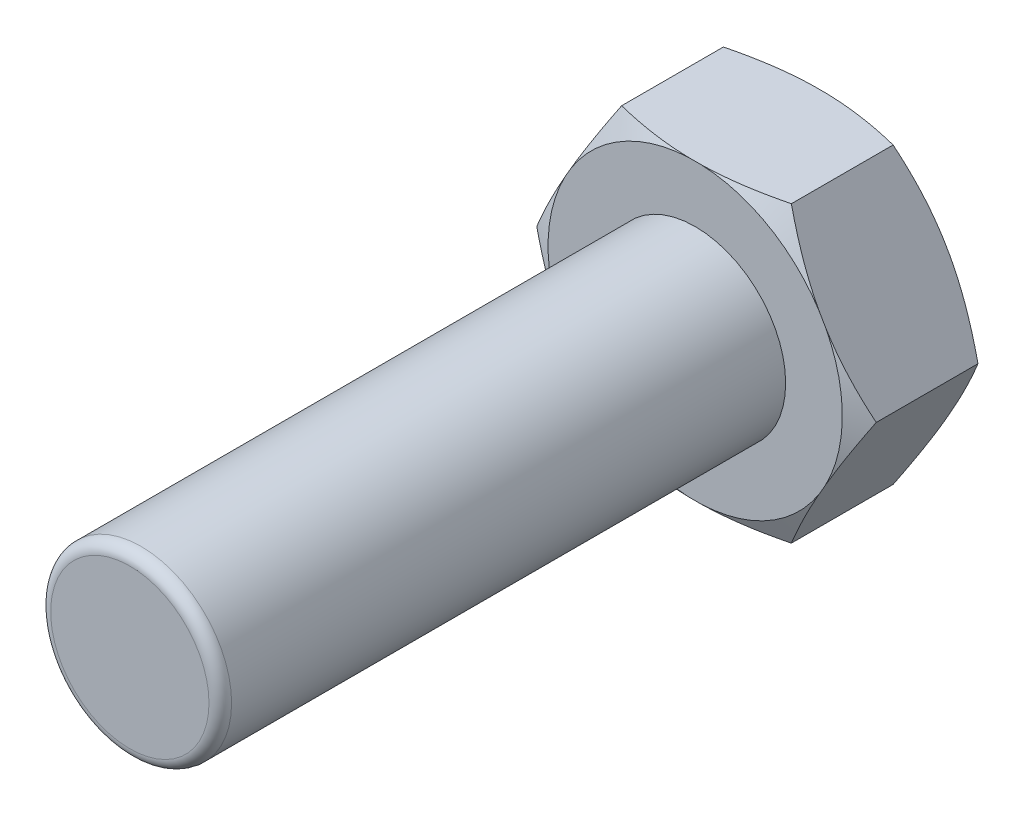
ISO-10303-21;
HEADER;
FILE_DESCRIPTION(('STEP AP214'),'2;1');
FILE_NAME('part.step','',(''),(''),'','','');
FILE_SCHEMA(('AUTOMOTIVE_DESIGN { 1 0 10303 214 1 1 1 1 }'));
ENDSEC;
DATA;
#1=APPLICATION_CONTEXT('core data for automotive mechanical design processes');
#2=APPLICATION_PROTOCOL_DEFINITION('international standard','automotive_design',2000,#1);
#3=PRODUCT_CONTEXT('',#1,'mechanical');
#4=PRODUCT('Part','Part','',(#3));
#5=PRODUCT_RELATED_PRODUCT_CATEGORY('part','',(#4));
#6=PRODUCT_DEFINITION_FORMATION('','',#4);
#7=PRODUCT_DEFINITION_CONTEXT('part definition',#1,'design');
#8=PRODUCT_DEFINITION('design','',#6,#7);
#9=PRODUCT_DEFINITION_SHAPE('','',#8);
#10=(LENGTH_UNIT() NAMED_UNIT(*) SI_UNIT(.MILLI.,.METRE.));
#11=(NAMED_UNIT(*) PLANE_ANGLE_UNIT() SI_UNIT($,.RADIAN.));
#12=(NAMED_UNIT(*) SI_UNIT($,.STERADIAN.) SOLID_ANGLE_UNIT());
#13=UNCERTAINTY_MEASURE_WITH_UNIT(LENGTH_MEASURE(1.E-05),#10,'distance_accuracy_value','');
#14=(GEOMETRIC_REPRESENTATION_CONTEXT(3) GLOBAL_UNCERTAINTY_ASSIGNED_CONTEXT((#13)) GLOBAL_UNIT_ASSIGNED_CONTEXT((#10,
#11,#12)) REPRESENTATION_CONTEXT('',''));
#15=CARTESIAN_POINT('',(0.,0.,0.));
#16=DIRECTION('',(0.,0.,1.));
#17=DIRECTION('',(1.,0.,0.));
#18=AXIS2_PLACEMENT_3D('',#15,#16,#17);
#19=CARTESIAN_POINT('',(0.,0.,5.5));
#20=DIRECTION('',(0.,0.,1.));
#21=DIRECTION('',(1.,0.,0.));
#22=AXIS2_PLACEMENT_3D('',#19,#20,#21);
#23=PLANE('',#22);
#24=CARTESIAN_POINT('',(0.,0.,5.5));
#25=DIRECTION('',(0.,0.,1.));
#26=DIRECTION('',(1.,0.,0.));
#27=AXIS2_PLACEMENT_3D('',#24,#25,#26);
#28=CIRCLE('',#27,4.);
#29=CARTESIAN_POINT('',(4.,0.,5.5));
#30=VERTEX_POINT('',#29);
#31=EDGE_CURVE('E220',#30,#30,#28,.T.);
#32=ORIENTED_EDGE('',*,*,#31,.F.);
#33=EDGE_LOOP('',(#32));
#34=FACE_BOUND('',#33,.T.);
#35=CARTESIAN_POINT('',(0.,0.,5.5));
#36=DIRECTION('',(0.,0.,1.));
#37=DIRECTION('',(1.,0.,0.));
#38=AXIS2_PLACEMENT_3D('',#35,#36,#37);
#39=CIRCLE('',#38,6.50555349946514);
#40=CARTESIAN_POINT('',(5.49479033678218,-3.48274395975477,5.5));
#41=VERTEX_POINT('',#40);
#42=CARTESIAN_POINT('',(0.268749575633286,-6.5,5.5));
#43=VERTEX_POINT('',#42);
#44=EDGE_CURVE('E227',#41,#43,#39,.F.);
#45=ORIENTED_EDGE('',*,*,#44,.F.);
#46=DIRECTION('',(0.5,0.866025403784439,0.));
#47=VECTOR('',#46,1.);
#48=CARTESIAN_POINT('',(3.75277674973257,-6.5,5.5));
#49=LINE('',#48,#47);
#50=CARTESIAN_POINT('',(5.76353991241553,-3.01725604024523,5.5));
#51=VERTEX_POINT('',#50);
#52=EDGE_CURVE('E203',#41,#51,#49,.T.);
#53=ORIENTED_EDGE('',*,*,#52,.T.);
#54=CARTESIAN_POINT('',(5.76353991241553,3.01725604024522,5.5));
#55=VERTEX_POINT('',#54);
#56=EDGE_CURVE('E225',#55,#51,#39,.F.);
#57=ORIENTED_EDGE('',*,*,#56,.F.);
#58=DIRECTION('',(-0.5,0.866025403784439,0.));
#59=VECTOR('',#58,1.);
#60=CARTESIAN_POINT('',(7.50555349946513,0.,5.5));
#61=LINE('',#60,#59);
#62=CARTESIAN_POINT('',(5.49479033678217,3.48274395975478,5.5));
#63=VERTEX_POINT('',#62);
#64=EDGE_CURVE('E258',#55,#63,#61,.T.);
#65=ORIENTED_EDGE('',*,*,#64,.T.);
#66=CARTESIAN_POINT('',(0.268749575633261,6.5,5.5));
#67=VERTEX_POINT('',#66);
#68=EDGE_CURVE('E226',#67,#63,#39,.F.);
#69=ORIENTED_EDGE('',*,*,#68,.F.);
#70=DIRECTION('',(-1.,0.,0.));
#71=VECTOR('',#70,1.);
#72=CARTESIAN_POINT('',(3.75277674973256,6.5,5.5));
#73=LINE('',#72,#71);
#74=CARTESIAN_POINT('',(-0.268749575633261,6.5,5.5));
#75=VERTEX_POINT('',#74);
#76=EDGE_CURVE('E264',#67,#75,#73,.T.);
#77=ORIENTED_EDGE('',*,*,#76,.T.);
#78=CARTESIAN_POINT('',(-5.4947903367822,3.48274395975472,5.5));
#79=VERTEX_POINT('',#78);
#80=EDGE_CURVE('E237',#79,#75,#39,.F.);
#81=ORIENTED_EDGE('',*,*,#80,.F.);
#82=DIRECTION('',(-0.5,-0.866025403784439,0.));
#83=VECTOR('',#82,1.);
#84=CARTESIAN_POINT('',(-3.75277674973257,6.5,5.5));
#85=LINE('',#84,#83);
#86=CARTESIAN_POINT('',(-5.7635399124155,3.01725604024527,5.5));
#87=VERTEX_POINT('',#86);
#88=EDGE_CURVE('E266',#79,#87,#85,.T.);
#89=ORIENTED_EDGE('',*,*,#88,.T.);
#90=CARTESIAN_POINT('',(-5.76353991241548,-3.01725604024531,5.5));
#91=VERTEX_POINT('',#90);
#92=EDGE_CURVE('E235',#91,#87,#39,.F.);
#93=ORIENTED_EDGE('',*,*,#92,.F.);
#94=DIRECTION('',(0.5,-0.866025403784438,0.));
#95=VECTOR('',#94,1.);
#96=CARTESIAN_POINT('',(-7.50555349946514,0.,5.5));
#97=LINE('',#96,#95);
#98=CARTESIAN_POINT('',(-5.49479033678222,-3.48274395975469,5.5));
#99=VERTEX_POINT('',#98);
#100=EDGE_CURVE('E273',#91,#99,#97,.T.);
#101=ORIENTED_EDGE('',*,*,#100,.T.);
#102=CARTESIAN_POINT('',(-0.268749575633286,-6.5,5.5));
#103=VERTEX_POINT('',#102);
#104=EDGE_CURVE('E231',#103,#99,#39,.F.);
#105=ORIENTED_EDGE('',*,*,#104,.F.);
#106=DIRECTION('',(1.,0.,0.));
#107=VECTOR('',#106,1.);
#108=CARTESIAN_POINT('',(-3.75277674973257,-6.5,5.5));
#109=LINE('',#108,#107);
#110=EDGE_CURVE('E208',#103,#43,#109,.T.);
#111=ORIENTED_EDGE('',*,*,#110,.T.);
#112=EDGE_LOOP('',(#45,#53,#57,#65,#69,#77,#81,#89,#93,#101,#105,#111));
#113=FACE_BOUND('',#112,.T.);
#114=ADVANCED_FACE('F39',(#34,#113),#23,.T.);
#115=CARTESIAN_POINT('',(0.,0.,0.));
#116=DIRECTION('',(0.,0.,1.));
#117=DIRECTION('',(1.,0.,0.));
#118=AXIS2_PLACEMENT_3D('',#115,#116,#117);
#119=PLANE('',#118);
#120=DIRECTION('',(0.5,0.866025403784439,0.));
#121=VECTOR('',#120,1.);
#122=CARTESIAN_POINT('',(3.75277674973257,-6.5,0.));
#123=LINE('',#122,#121);
#124=CARTESIAN_POINT('',(5.49479033678218,-3.48274395975477,0.));
#125=VERTEX_POINT('',#124);
#126=CARTESIAN_POINT('',(5.76353991241553,-3.01725604024523,0.));
#127=VERTEX_POINT('',#126);
#128=EDGE_CURVE('E278',#125,#127,#123,.T.);
#129=ORIENTED_EDGE('',*,*,#128,.F.);
#130=CARTESIAN_POINT('',(0.,0.,0.));
#131=DIRECTION('',(0.,0.,1.));
#132=DIRECTION('',(1.,0.,0.));
#133=AXIS2_PLACEMENT_3D('',#130,#131,#132);
#134=CIRCLE('',#133,6.50555349946514);
#135=CARTESIAN_POINT('',(0.268749575633286,-6.5,0.));
#136=VERTEX_POINT('',#135);
#137=EDGE_CURVE('E224',#125,#136,#134,.F.);
#138=ORIENTED_EDGE('',*,*,#137,.T.);
#139=DIRECTION('',(1.,0.,0.));
#140=VECTOR('',#139,1.);
#141=CARTESIAN_POINT('',(-3.75277674973257,-6.5,0.));
#142=LINE('',#141,#140);
#143=CARTESIAN_POINT('',(-0.268749575633286,-6.5,0.));
#144=VERTEX_POINT('',#143);
#145=EDGE_CURVE('E195',#144,#136,#142,.T.);
#146=ORIENTED_EDGE('',*,*,#145,.F.);
#147=CARTESIAN_POINT('',(-5.49479033678222,-3.48274395975469,0.));
#148=VERTEX_POINT('',#147);
#149=EDGE_CURVE('E596',#144,#148,#134,.F.);
#150=ORIENTED_EDGE('',*,*,#149,.T.);
#151=DIRECTION('',(0.5,-0.866025403784438,0.));
#152=VECTOR('',#151,1.);
#153=CARTESIAN_POINT('',(-7.50555349946514,0.,0.));
#154=LINE('',#153,#152);
#155=CARTESIAN_POINT('',(-5.76353991241548,-3.01725604024531,0.));
#156=VERTEX_POINT('',#155);
#157=EDGE_CURVE('E191',#156,#148,#154,.T.);
#158=ORIENTED_EDGE('',*,*,#157,.F.);
#159=CARTESIAN_POINT('',(-5.7635399124155,3.01725604024527,0.));
#160=VERTEX_POINT('',#159);
#161=EDGE_CURVE('E173',#156,#160,#134,.F.);
#162=ORIENTED_EDGE('',*,*,#161,.T.);
#163=DIRECTION('',(-0.5,-0.866025403784439,0.));
#164=VECTOR('',#163,1.);
#165=CARTESIAN_POINT('',(-3.75277674973257,6.5,0.));
#166=LINE('',#165,#164);
#167=CARTESIAN_POINT('',(-5.4947903367822,3.48274395975472,0.));
#168=VERTEX_POINT('',#167);
#169=EDGE_CURVE('E181',#168,#160,#166,.T.);
#170=ORIENTED_EDGE('',*,*,#169,.F.);
#171=CARTESIAN_POINT('',(-0.268749575633261,6.5,0.));
#172=VERTEX_POINT('',#171);
#173=EDGE_CURVE('E163',#168,#172,#134,.F.);
#174=ORIENTED_EDGE('',*,*,#173,.T.);
#175=DIRECTION('',(-1.,0.,0.));
#176=VECTOR('',#175,1.);
#177=CARTESIAN_POINT('',(3.75277674973256,6.5,0.));
#178=LINE('',#177,#176);
#179=CARTESIAN_POINT('',(0.268749575633261,6.5,0.));
#180=VERTEX_POINT('',#179);
#181=EDGE_CURVE('E192',#180,#172,#178,.T.);
#182=ORIENTED_EDGE('',*,*,#181,.F.);
#183=CARTESIAN_POINT('',(5.49479033678217,3.48274395975478,0.));
#184=VERTEX_POINT('',#183);
#185=EDGE_CURVE('E174',#180,#184,#134,.F.);
#186=ORIENTED_EDGE('',*,*,#185,.T.);
#187=DIRECTION('',(-0.5,0.866025403784439,0.));
#188=VECTOR('',#187,1.);
#189=CARTESIAN_POINT('',(7.50555349946513,0.,0.));
#190=LINE('',#189,#188);
#191=CARTESIAN_POINT('',(5.76353991241553,3.01725604024522,0.));
#192=VERTEX_POINT('',#191);
#193=EDGE_CURVE('E197',#192,#184,#190,.T.);
#194=ORIENTED_EDGE('',*,*,#193,.F.);
#195=EDGE_CURVE('E221',#192,#127,#134,.F.);
#196=ORIENTED_EDGE('',*,*,#195,.T.);
#197=EDGE_LOOP('',(#129,#138,#146,#150,#158,#162,#170,#174,#182,#186,#194,#196));
#198=FACE_BOUND('',#197,.T.);
#199=ADVANCED_FACE('F189',(#198),#119,.F.);
#200=CARTESIAN_POINT('',(3.75277674973257,-6.5,5.5));
#201=DIRECTION('',(-0.866025403784439,0.5,0.));
#202=DIRECTION('',(-0.5,-0.866025403784439,0.));
#203=AXIS2_PLACEMENT_3D('',#200,#201,#202);
#204=PLANE('',#203);
#205=DIRECTION('',(0.,0.,-1.));
#206=VECTOR('',#205,1.);
#207=CARTESIAN_POINT('',(3.75277674973257,-6.5,5.5));
#208=LINE('',#207,#206);
#209=CARTESIAN_POINT('',(3.75277674973257,-6.5,5.));
#210=VERTEX_POINT('',#209);
#211=CARTESIAN_POINT('',(3.75277674973257,-6.5,0.5));
#212=VERTEX_POINT('',#211);
#213=EDGE_CURVE('E204',#210,#212,#208,.T.);
#214=ORIENTED_EDGE('',*,*,#213,.T.);
#215=CARTESIAN_POINT('',(3.75237260454413,-6.5007,0.500202088914585));
#216=CARTESIAN_POINT('',(3.8581513468533,-6.3174858439598,0.447308100414797));
#217=CARTESIAN_POINT('',(3.96434221026252,-6.13355787323541,0.397552458642436));
#218=CARTESIAN_POINT('',(4.17756983432187,-5.76423679478743,0.305365614830753));
#219=CARTESIAN_POINT('',(4.28460700117574,-5.57884298349829,0.262938185371068));
#220=CARTESIAN_POINT('',(4.49959934134498,-5.20646532708704,0.186455410870334));
#221=CARTESIAN_POINT('',(4.60755563959989,-5.01947953351247,0.152412559968943));
#222=CARTESIAN_POINT('',(4.82409838792355,-4.6444164914053,0.0938297029314832));
#223=CARTESIAN_POINT('',(4.93268472608622,-4.4563394366997,0.0692880586741505));
#224=CARTESIAN_POINT('',(5.1478553862202,-4.0836529210495,0.031003092263815));
#225=CARTESIAN_POINT('',(5.25442927124948,-3.89906153741879,0.0170275284853245));
#226=CARTESIAN_POINT('',(5.4677990566594,-3.52949422828874,-0.000510400439065489));
#227=CARTESIAN_POINT('',(5.57459496772756,-3.34451828427808,-0.00407225212184421));
#228=CARTESIAN_POINT('',(5.78802860217816,-2.97484038536555,-0.000644602363145451));
#229=CARTESIAN_POINT('',(5.8946663719813,-2.79013835006069,0.00633352888495326));
#230=CARTESIAN_POINT('',(6.10763808623,-2.42126052040688,0.0305511734218139));
#231=CARTESIAN_POINT('',(6.21397205579703,-2.23708468254632,0.0477898120447853));
#232=CARTESIAN_POINT('',(6.41948815126255,-1.88112036342686,0.0905216057624534));
#233=CARTESIAN_POINT('',(6.5187011062663,-1.70927848459131,0.11543017165032));
#234=CARTESIAN_POINT('',(6.71656951926134,-1.36656034007088,0.173005823171236));
#235=CARTESIAN_POINT('',(6.81522491642766,-1.19568417973793,0.205673739175031));
#236=CARTESIAN_POINT('',(7.01298812041286,-0.853148262567952,0.278357612028755));
#237=CARTESIAN_POINT('',(7.11208869539026,-0.681501031647809,0.318451480294036));
#238=CARTESIAN_POINT('',(7.30956235262323,-0.339466624163873,0.404867578606761));
#239=CARTESIAN_POINT('',(7.40793575289547,-0.169078896779033,0.451186892347521));
#240=CARTESIAN_POINT('',(7.50595764465357,0.000700000000001562,0.500202088914583));
#241=B_SPLINE_CURVE_WITH_KNOTS('',3,(#215,#216,#217,#218,#219,#220,#221,#222,#223,#224,#225,
#226,#227,#228,#229,#230,#231,#232,#233,#234,#235,#236,#237,#238,#239,#240),.UNSPECIFIED.,.F.,
.F.,(4,2,2,2,2,2,2,2,2,2,2,2,4),(0.,0.654242187553569,1.30882018300877,1.96436776438002,
2.61980227114733,3.26037426611438,3.90097784487654,4.54089085456767,5.18074932213415,
5.78053406899308,6.38038303105972,6.98692412571604,7.59318207044967),.UNSPECIFIED.);
#242=EDGE_CURVE('E336',#212,#125,#241,.T.);
#243=ORIENTED_EDGE('',*,*,#242,.T.);
#244=ORIENTED_EDGE('',*,*,#128,.T.);
#245=CARTESIAN_POINT('',(7.50555349946514,0.,0.5));
#246=VERTEX_POINT('',#245);
#247=EDGE_CURVE('E603',#127,#246,#241,.T.);
#248=ORIENTED_EDGE('',*,*,#247,.T.);
#249=DIRECTION('',(0.,0.,-1.));
#250=VECTOR('',#249,1.);
#251=CARTESIAN_POINT('',(7.50555349946513,0.,5.5));
#252=LINE('',#251,#250);
#253=CARTESIAN_POINT('',(7.50555349946514,0.,5.));
#254=VERTEX_POINT('',#253);
#255=EDGE_CURVE('E218',#254,#246,#252,.T.);
#256=ORIENTED_EDGE('',*,*,#255,.F.);
#257=CARTESIAN_POINT('',(7.50595764465357,0.000700000000001858,4.99979791108542));
#258=CARTESIAN_POINT('',(7.4001789023444,-0.182514156040201,5.0526918995852));
#259=CARTESIAN_POINT('',(7.29398803893518,-0.366442126764588,5.10244754135756));
#260=CARTESIAN_POINT('',(7.08076041487583,-0.735763205212568,5.19463438516925));
#261=CARTESIAN_POINT('',(6.97372324802196,-0.921157016501705,5.23706181462893));
#262=CARTESIAN_POINT('',(6.75873090785272,-1.29353467291295,5.31354458912967));
#263=CARTESIAN_POINT('',(6.65077460959781,-1.48052046648752,5.34758744003106));
#264=CARTESIAN_POINT('',(6.43423186127415,-1.8555835085947,5.40617029706852));
#265=CARTESIAN_POINT('',(6.32564552311148,-2.0436605633003,5.43071194132585));
#266=CARTESIAN_POINT('',(6.1104748629775,-2.41634707895049,5.46899690773619));
#267=CARTESIAN_POINT('',(6.00390097794822,-2.6009384625812,5.48297247151467));
#268=CARTESIAN_POINT('',(5.7905311925383,-2.97050577171125,5.50051040043907));
#269=CARTESIAN_POINT('',(5.68373528147015,-3.15548171572191,5.50407225212184));
#270=CARTESIAN_POINT('',(5.47030164701954,-3.52515961463445,5.50064460236315));
#271=CARTESIAN_POINT('',(5.36366387721641,-3.70986164993931,5.49366647111505));
#272=CARTESIAN_POINT('',(5.1506921629677,-4.07873947959311,5.46944882657819));
#273=CARTESIAN_POINT('',(5.04435819340067,-4.26291531745367,5.45221018795521));
#274=CARTESIAN_POINT('',(4.83884209793515,-4.61887963657314,5.40947839423755));
#275=CARTESIAN_POINT('',(4.7396291429314,-4.79072151540868,5.38456982834968));
#276=CARTESIAN_POINT('',(4.54176072993636,-5.13343965992911,5.32699417682876));
#277=CARTESIAN_POINT('',(4.44310533277004,-5.30431582026207,5.29432626082497));
#278=CARTESIAN_POINT('',(4.24534212878484,-5.64685173743205,5.22164238797124));
#279=CARTESIAN_POINT('',(4.14624155380744,-5.81849896835219,5.18154851970596));
#280=CARTESIAN_POINT('',(3.94876789657447,-6.16053337583612,5.09513242139324));
#281=CARTESIAN_POINT('',(3.85039449630223,-6.33092110322097,5.04881310765248));
#282=CARTESIAN_POINT('',(3.75237260454413,-6.5007,4.99979791108542));
#283=B_SPLINE_CURVE_WITH_KNOTS('',3,(#257,#258,#259,#260,#261,#262,#263,#264,#265,#266,#267,
#268,#269,#270,#271,#272,#273,#274,#275,#276,#277,#278,#279,#280,#281,#282),.UNSPECIFIED.,.F.,
.F.,(4,2,2,2,2,2,2,2,2,2,2,2,4),(0.,0.654242187553568,1.30882018300877,1.96436776438002,
2.61980227114733,3.26037426611438,3.90097784487653,4.54089085456766,5.18074932213414,
5.78053406899307,6.38038303105972,6.98692412571604,7.59318207044967),.UNSPECIFIED.);
#284=EDGE_CURVE('E280',#254,#51,#283,.T.);
#285=ORIENTED_EDGE('',*,*,#284,.T.);
#286=ORIENTED_EDGE('',*,*,#52,.F.);
#287=EDGE_CURVE('E372',#41,#210,#283,.T.);
#288=ORIENTED_EDGE('',*,*,#287,.T.);
#289=EDGE_LOOP('',(#214,#243,#244,#248,#256,#285,#286,#288));
#290=FACE_BOUND('',#289,.T.);
#291=ADVANCED_FACE('F385',(#290),#204,.F.);
#292=CARTESIAN_POINT('',(7.50555349946513,0.,5.5));
#293=DIRECTION('',(-0.866025403784439,-0.5,0.));
#294=DIRECTION('',(0.5,-0.866025403784439,0.));
#295=AXIS2_PLACEMENT_3D('',#292,#293,#294);
#296=PLANE('',#295);
#297=ORIENTED_EDGE('',*,*,#255,.T.);
#298=CARTESIAN_POINT('',(7.50595764465356,-0.00069999999999797,0.500202088914583));
#299=CARTESIAN_POINT('',(7.4001789023444,0.182514156040205,0.447308100414796));
#300=CARTESIAN_POINT('',(7.29398803893518,0.366442126764592,0.397552458642435));
#301=CARTESIAN_POINT('',(7.08076041487583,0.735763205212573,0.305365614830752));
#302=CARTESIAN_POINT('',(6.97372324802196,0.921157016501709,0.262938185371066));
#303=CARTESIAN_POINT('',(6.75873090785272,1.29353467291296,0.186455410870333));
#304=CARTESIAN_POINT('',(6.65077460959781,1.48052046648753,0.152412559968942));
#305=CARTESIAN_POINT('',(6.43423186127415,1.85558350859471,0.0938297029314831));
#306=CARTESIAN_POINT('',(6.32564552311148,2.0436605633003,0.0692880586741502));
#307=CARTESIAN_POINT('',(6.1104748629775,2.4163470789505,0.0310030922638145));
#308=CARTESIAN_POINT('',(6.00390097794822,2.60093846258121,0.0170275284853243));
#309=CARTESIAN_POINT('',(5.7905311925383,2.97050577171126,-0.000510400439065394));
#310=CARTESIAN_POINT('',(5.68373528147014,3.15548171572192,-0.00407225212184394));
#311=CARTESIAN_POINT('',(5.47030164701954,3.52515961463445,-0.000644602363145258));
#312=CARTESIAN_POINT('',(5.3636638772164,3.70986164993931,0.00633352888495324));
#313=CARTESIAN_POINT('',(5.15069216296769,4.07873947959312,0.0305511734218142));
#314=CARTESIAN_POINT('',(5.04435819340067,4.26291531745368,0.0477898120447861));
#315=CARTESIAN_POINT('',(4.83884209793515,4.61887963657314,0.0905216057624544));
#316=CARTESIAN_POINT('',(4.7396291429314,4.79072151540869,0.115430171650321));
#317=CARTESIAN_POINT('',(4.54176072993636,5.13343965992912,0.173005823171237));
#318=CARTESIAN_POINT('',(4.44310533277004,5.30431582026207,0.205673739175032));
#319=CARTESIAN_POINT('',(4.24534212878483,5.64685173743205,0.278357612028756));
#320=CARTESIAN_POINT('',(4.14624155380744,5.81849896835219,0.318451480294037));
#321=CARTESIAN_POINT('',(3.94876789657447,6.16053337583613,0.404867578606762));
#322=CARTESIAN_POINT('',(3.85039449630223,6.33092110322097,0.451186892347522));
#323=CARTESIAN_POINT('',(3.75237260454413,6.5007,0.500202088914585));
#324=B_SPLINE_CURVE_WITH_KNOTS('',3,(#298,#299,#300,#301,#302,#303,#304,#305,#306,#307,#308,
#309,#310,#311,#312,#313,#314,#315,#316,#317,#318,#319,#320,#321,#322,#323),.UNSPECIFIED.,.F.,
.F.,(4,2,2,2,2,2,2,2,2,2,2,2,4),(0.,0.654242187553569,1.30882018300877,1.96436776438002,
2.61980227114733,3.26037426611438,3.90097784487654,4.54089085456767,5.18074932213415,
5.78053406899307,6.38038303105972,6.98692412571604,7.59318207044967),.UNSPECIFIED.);
#325=EDGE_CURVE('E285',#246,#192,#324,.T.);
#326=ORIENTED_EDGE('',*,*,#325,.T.);
#327=ORIENTED_EDGE('',*,*,#193,.T.);
#328=CARTESIAN_POINT('',(3.75277674973257,6.5,0.5));
#329=VERTEX_POINT('',#328);
#330=EDGE_CURVE('E284',#184,#329,#324,.T.);
#331=ORIENTED_EDGE('',*,*,#330,.T.);
#332=DIRECTION('',(0.,0.,-1.));
#333=VECTOR('',#332,1.);
#334=CARTESIAN_POINT('',(3.75277674973256,6.5,5.5));
#335=LINE('',#334,#333);
#336=CARTESIAN_POINT('',(3.75277674973257,6.5,5.));
#337=VERTEX_POINT('',#336);
#338=EDGE_CURVE('E215',#337,#329,#335,.T.);
#339=ORIENTED_EDGE('',*,*,#338,.F.);
#340=CARTESIAN_POINT('',(3.75237260454413,6.5007,4.99979791108542));
#341=CARTESIAN_POINT('',(3.85815134685329,6.3174858439598,5.0526918995852));
#342=CARTESIAN_POINT('',(3.96434221026252,6.13355787323541,5.10244754135756));
#343=CARTESIAN_POINT('',(4.17756983432187,5.76423679478743,5.19463438516925));
#344=CARTESIAN_POINT('',(4.28460700117574,5.57884298349829,5.23706181462893));
#345=CARTESIAN_POINT('',(4.49959934134498,5.20646532708704,5.31354458912967));
#346=CARTESIAN_POINT('',(4.60755563959989,5.01947953351247,5.34758744003106));
#347=CARTESIAN_POINT('',(4.82409838792355,4.6444164914053,5.40617029706852));
#348=CARTESIAN_POINT('',(4.93268472608622,4.4563394366997,5.43071194132585));
#349=CARTESIAN_POINT('',(5.1478553862202,4.08365292104951,5.46899690773619));
#350=CARTESIAN_POINT('',(5.25442927124948,3.89906153741879,5.48297247151467));
#351=CARTESIAN_POINT('',(5.4677990566594,3.52949422828874,5.50051040043907));
#352=CARTESIAN_POINT('',(5.57459496772755,3.34451828427809,5.50407225212184));
#353=CARTESIAN_POINT('',(5.78802860217816,2.97484038536555,5.50064460236315));
#354=CARTESIAN_POINT('',(5.8946663719813,2.79013835006069,5.49366647111505));
#355=CARTESIAN_POINT('',(6.10763808623,2.42126052040689,5.46944882657819));
#356=CARTESIAN_POINT('',(6.21397205579703,2.23708468254632,5.45221018795521));
#357=CARTESIAN_POINT('',(6.41948815126255,1.88112036342686,5.40947839423755));
#358=CARTESIAN_POINT('',(6.5187011062663,1.70927848459132,5.38456982834968));
#359=CARTESIAN_POINT('',(6.71656951926134,1.36656034007089,5.32699417682876));
#360=CARTESIAN_POINT('',(6.81522491642766,1.19568417973793,5.29432626082497));
#361=CARTESIAN_POINT('',(7.01298812041286,0.853148262567956,5.22164238797124));
#362=CARTESIAN_POINT('',(7.11208869539026,0.681501031647813,5.18154851970596));
#363=CARTESIAN_POINT('',(7.30956235262322,0.339466624163877,5.09513242139324));
#364=CARTESIAN_POINT('',(7.40793575289547,0.169078896779037,5.04881310765248));
#365=CARTESIAN_POINT('',(7.50595764465356,-0.000699999999997427,4.99979791108542));
#366=B_SPLINE_CURVE_WITH_KNOTS('',3,(#340,#341,#342,#343,#344,#345,#346,#347,#348,#349,#350,
#351,#352,#353,#354,#355,#356,#357,#358,#359,#360,#361,#362,#363,#364,#365),.UNSPECIFIED.,.F.,
.F.,(4,2,2,2,2,2,2,2,2,2,2,2,4),(0.,0.65424218755357,1.30882018300877,1.96436776438002,
2.61980227114733,3.26037426611438,3.90097784487654,4.54089085456767,5.18074932213415,
5.78053406899307,6.38038303105972,6.98692412571604,7.59318207044967),.UNSPECIFIED.);
#367=EDGE_CURVE('E246',#337,#63,#366,.T.);
#368=ORIENTED_EDGE('',*,*,#367,.T.);
#369=ORIENTED_EDGE('',*,*,#64,.F.);
#370=EDGE_CURVE('E260',#55,#254,#366,.T.);
#371=ORIENTED_EDGE('',*,*,#370,.T.);
#372=EDGE_LOOP('',(#297,#326,#327,#331,#339,#368,#369,#371));
#373=FACE_BOUND('',#372,.T.);
#374=ADVANCED_FACE('F256',(#373),#296,.F.);
#375=CARTESIAN_POINT('',(3.75277674973256,6.5,5.5));
#376=DIRECTION('',(0.,-1.,0.));
#377=DIRECTION('',(0.,0.,-1.));
#378=AXIS2_PLACEMENT_3D('',#375,#376,#377);
#379=PLANE('',#378);
#380=ORIENTED_EDGE('',*,*,#338,.T.);
#381=CARTESIAN_POINT('',(3.75347674973256,6.5,0.500175012240365));
#382=CARTESIAN_POINT('',(3.54192162519923,6.5,0.447282755969558));
#383=CARTESIAN_POINT('',(3.32954227379659,6.5,0.397528857024414));
#384=CARTESIAN_POINT('',(2.90309182650538,6.5,0.305345485202523));
#385=CARTESIAN_POINT('',(2.68901991825973,6.5,0.262919784770842));
#386=CARTESIAN_POINT('',(2.25904019363984,6.5,0.186440425956892));
#387=CARTESIAN_POINT('',(2.04313012776865,6.5,0.152399260005533));
#388=CARTESIAN_POINT('',(1.6100497632385,6.5,0.0938196616704836));
#389=CARTESIAN_POINT('',(1.39287968837432,6.5,0.0692795912208281));
#390=CARTESIAN_POINT('',(0.962543417507529,6.5,0.0309975490733606));
#391=CARTESIAN_POINT('',(0.749398092974236,6.5,0.0170233475587274));
#392=CARTESIAN_POINT('',(0.322663478736452,6.5,-0.000512066325803271));
#393=CARTESIAN_POINT('',(0.109074167659224,6.5,-0.00407276522012902));
#394=CARTESIAN_POINT('',(-0.31778804759895,6.5,-0.000643068305750199));
#395=CARTESIAN_POINT('',(-0.531061044668984,6.5,0.00633595837845697));
#396=CARTESIAN_POINT('',(-0.95699936095713,6.5,0.0305551115069941));
#397=CARTESIAN_POINT('',(-1.16966473042201,6.5,0.0477943632817789));
#398=CARTESIAN_POINT('',(-1.58068117508018,6.5,0.0905259486290271));
#399=CARTESIAN_POINT('',(-1.77909395716747,6.5,0.115433252203116));
#400=CARTESIAN_POINT('',(-2.17480466284762,6.5,0.173005342178703));
#401=CARTESIAN_POINT('',(-2.3721024648757,6.5,0.205670958367692));
#402=CARTESIAN_POINT('',(-2.76760272502698,6.5,0.278349291876491));
#403=CARTESIAN_POINT('',(-2.96579072274422,6.5,0.318439903827291));
#404=CARTESIAN_POINT('',(-3.360711947741,6.5,0.404848758409281));
#405=CARTESIAN_POINT('',(-3.5574458108006,6.5,0.451164085844501));
#406=CARTESIAN_POINT('',(-3.75347674973257,6.5,0.500175012240366));
#407=B_SPLINE_CURVE_WITH_KNOTS('',3,(#381,#382,#383,#384,#385,#386,#387,#388,#389,#390,#391,
#392,#393,#394,#395,#396,#397,#398,#399,#400,#401,#402,#403,#404,#405,#406),.UNSPECIFIED.,.F.,
.F.,(4,2,2,2,2,2,2,2,2,2,2,2,4),(0.,0.654234056420655,1.30880390529539,1.96434320152268,
2.61976942707328,3.26033383975563,3.9009298372606,4.54083532196571,5.18068626345358,
5.78043149769994,6.38024090638788,6.98674140943669,7.5929588559283),.UNSPECIFIED.);
#408=EDGE_CURVE('E290',#329,#180,#407,.T.);
#409=ORIENTED_EDGE('',*,*,#408,.T.);
#410=ORIENTED_EDGE('',*,*,#181,.T.);
#411=CARTESIAN_POINT('',(-3.75277674973257,6.5,0.5));
#412=VERTEX_POINT('',#411);
#413=EDGE_CURVE('E168',#172,#412,#407,.T.);
#414=ORIENTED_EDGE('',*,*,#413,.T.);
#415=DIRECTION('',(0.,0.,-1.));
#416=VECTOR('',#415,1.);
#417=CARTESIAN_POINT('',(-3.75277674973257,6.5,5.5));
#418=LINE('',#417,#416);
#419=CARTESIAN_POINT('',(-3.75277674973257,6.5,5.));
#420=VERTEX_POINT('',#419);
#421=EDGE_CURVE('E184',#420,#412,#418,.T.);
#422=ORIENTED_EDGE('',*,*,#421,.F.);
#423=CARTESIAN_POINT('',(-3.75347674973257,6.5,4.99982498775963));
#424=CARTESIAN_POINT('',(-3.54192162519923,6.5,5.05271724403044));
#425=CARTESIAN_POINT('',(-3.32954227379659,6.5,5.10247114297559));
#426=CARTESIAN_POINT('',(-2.90309182650538,6.5,5.19465451479748));
#427=CARTESIAN_POINT('',(-2.68901991825973,6.5,5.23708021522916));
#428=CARTESIAN_POINT('',(-2.25904019363984,6.5,5.31355957404311));
#429=CARTESIAN_POINT('',(-2.04313012776865,6.5,5.34760073999447));
#430=CARTESIAN_POINT('',(-1.61004976323851,6.5,5.40618033832952));
#431=CARTESIAN_POINT('',(-1.39287968837432,6.5,5.43072040877917));
#432=CARTESIAN_POINT('',(-0.962543417507533,6.5,5.46900245092664));
#433=CARTESIAN_POINT('',(-0.749398092974241,6.5,5.48297665244127));
#434=CARTESIAN_POINT('',(-0.322663478736457,6.5,5.5005120663258));
#435=CARTESIAN_POINT('',(-0.10907416765923,6.5,5.50407276522013));
#436=CARTESIAN_POINT('',(0.317788047598944,6.5,5.50064306830575));
#437=CARTESIAN_POINT('',(0.531061044668979,6.5,5.49366404162154));
#438=CARTESIAN_POINT('',(0.956999360957123,6.5,5.46944488849301));
#439=CARTESIAN_POINT('',(1.16966473042201,6.5,5.45220563671822));
#440=CARTESIAN_POINT('',(1.58068117508018,6.5,5.40947405137097));
#441=CARTESIAN_POINT('',(1.77909395716747,6.5,5.38456674779688));
#442=CARTESIAN_POINT('',(2.17480466284761,6.5,5.3269946578213));
#443=CARTESIAN_POINT('',(2.3721024648757,6.5,5.29432904163231));
#444=CARTESIAN_POINT('',(2.76760272502698,6.5,5.22165070812351));
#445=CARTESIAN_POINT('',(2.96579072274422,6.5,5.18156009617271));
#446=CARTESIAN_POINT('',(3.360711947741,6.5,5.09515124159072));
#447=CARTESIAN_POINT('',(3.55744581080059,6.5,5.0488359141555));
#448=CARTESIAN_POINT('',(3.75347674973256,6.5,4.99982498775963));
#449=B_SPLINE_CURVE_WITH_KNOTS('',3,(#423,#424,#425,#426,#427,#428,#429,#430,#431,#432,#433,
#434,#435,#436,#437,#438,#439,#440,#441,#442,#443,#444,#445,#446,#447,#448),.UNSPECIFIED.,.F.,
.F.,(4,2,2,2,2,2,2,2,2,2,2,2,4),(0.,0.654234056420655,1.30880390529539,1.96434320152268,
2.61976942707328,3.26033383975563,3.9009298372606,4.54083532196571,5.18068626345358,
5.78043149769993,6.38024090638788,6.98674140943668,7.5929588559283),.UNSPECIFIED.);
#450=EDGE_CURVE('E397',#420,#75,#449,.T.);
#451=ORIENTED_EDGE('',*,*,#450,.T.);
#452=ORIENTED_EDGE('',*,*,#76,.F.);
#453=EDGE_CURVE('E248',#67,#337,#449,.T.);
#454=ORIENTED_EDGE('',*,*,#453,.T.);
#455=EDGE_LOOP('',(#380,#409,#410,#414,#422,#451,#452,#454));
#456=FACE_BOUND('',#455,.T.);
#457=ADVANCED_FACE('F292',(#456),#379,.F.);
#458=CARTESIAN_POINT('',(-3.75277674973257,6.5,5.5));
#459=DIRECTION('',(0.866025403784439,-0.5,0.));
#460=DIRECTION('',(0.5,0.866025403784439,0.));
#461=AXIS2_PLACEMENT_3D('',#458,#459,#460);
#462=PLANE('',#461);
#463=ORIENTED_EDGE('',*,*,#421,.T.);
#464=CARTESIAN_POINT('',(-3.75237260454414,6.5007,0.500202088914585));
#465=CARTESIAN_POINT('',(-3.8581513468533,6.3174858439598,0.447308100414798));
#466=CARTESIAN_POINT('',(-3.96434221026252,6.13355787323541,0.397552458642437));
#467=CARTESIAN_POINT('',(-4.17756983432187,5.76423679478743,0.305365614830754));
#468=CARTESIAN_POINT('',(-4.28460700117574,5.57884298349829,0.262938185371069));
#469=CARTESIAN_POINT('',(-4.49959934134498,5.20646532708704,0.186455410870335));
#470=CARTESIAN_POINT('',(-4.60755563959989,5.01947953351247,0.152412559968944));
#471=CARTESIAN_POINT('',(-4.82409838792355,4.6444164914053,0.0938297029314844));
#472=CARTESIAN_POINT('',(-4.93268472608622,4.4563394366997,0.069288058674152));
#473=CARTESIAN_POINT('',(-5.1478553862202,4.08365292104951,0.0310030922638162));
#474=CARTESIAN_POINT('',(-5.25442927124948,3.89906153741879,0.0170275284853252));
#475=CARTESIAN_POINT('',(-5.4677990566594,3.52949422828874,-0.000510400439064884));
#476=CARTESIAN_POINT('',(-5.57459496772756,3.34451828427809,-0.00407225212184326));
#477=CARTESIAN_POINT('',(-5.78802860217816,2.97484038536555,-0.000644602363144531));
#478=CARTESIAN_POINT('',(-5.8946663719813,2.79013835006069,0.00633352888495383));
#479=CARTESIAN_POINT('',(-6.10763808623001,2.42126052040689,0.0305511734218144));
#480=CARTESIAN_POINT('',(-6.21397205579703,2.23708468254632,0.0477898120447861));
#481=CARTESIAN_POINT('',(-6.41948815126255,1.88112036342686,0.0905216057624543));
#482=CARTESIAN_POINT('',(-6.5187011062663,1.70927848459132,0.115430171650321));
#483=CARTESIAN_POINT('',(-6.71656951926134,1.36656034007089,0.173005823171237));
#484=CARTESIAN_POINT('',(-6.81522491642766,1.19568417973793,0.205673739175032));
#485=CARTESIAN_POINT('',(-7.01298812041287,0.853148262567952,0.278357612028756));
#486=CARTESIAN_POINT('',(-7.11208869539026,0.681501031647809,0.318451480294037));
#487=CARTESIAN_POINT('',(-7.30956235262323,0.339466624163872,0.404867578606763));
#488=CARTESIAN_POINT('',(-7.40793575289548,0.169078896779031,0.451186892347523));
#489=CARTESIAN_POINT('',(-7.50595764465357,-0.000700000000003896,0.500202088914586));
#490=B_SPLINE_CURVE_WITH_KNOTS('',3,(#464,#465,#466,#467,#468,#469,#470,#471,#472,#473,#474,
#475,#476,#477,#478,#479,#480,#481,#482,#483,#484,#485,#486,#487,#488,#489),.UNSPECIFIED.,.F.,
.F.,(4,2,2,2,2,2,2,2,2,2,2,2,4),(0.,0.65424218755357,1.30882018300877,1.96436776438002,
2.61980227114733,3.26037426611438,3.90097784487654,4.54089085456767,5.18074932213415,
5.78053406899307,6.38038303105972,6.98692412571605,7.59318207044967),.UNSPECIFIED.);
#491=EDGE_CURVE('E166',#412,#168,#490,.T.);
#492=ORIENTED_EDGE('',*,*,#491,.T.);
#493=ORIENTED_EDGE('',*,*,#169,.T.);
#494=CARTESIAN_POINT('',(-7.50555349946514,0.,0.5));
#495=VERTEX_POINT('',#494);
#496=EDGE_CURVE('E185',#160,#495,#490,.T.);
#497=ORIENTED_EDGE('',*,*,#496,.T.);
#498=DIRECTION('',(0.,0.,-1.));
#499=VECTOR('',#498,1.);
#500=CARTESIAN_POINT('',(-7.50555349946514,0.,5.5));
#501=LINE('',#500,#499);
#502=CARTESIAN_POINT('',(-7.50555349946514,0.,5.));
#503=VERTEX_POINT('',#502);
#504=EDGE_CURVE('E211',#503,#495,#501,.T.);
#505=ORIENTED_EDGE('',*,*,#504,.F.);
#506=CARTESIAN_POINT('',(-7.50595764465357,-0.000700000000003274,4.99979791108541));
#507=CARTESIAN_POINT('',(-7.40017890234441,0.1825141560402,5.0526918995852));
#508=CARTESIAN_POINT('',(-7.29398803893518,0.366442126764587,5.10244754135756));
#509=CARTESIAN_POINT('',(-7.08076041487584,0.735763205212567,5.19463438516925));
#510=CARTESIAN_POINT('',(-6.97372324802196,0.921157016501703,5.23706181462893));
#511=CARTESIAN_POINT('',(-6.75873090785273,1.29353467291295,5.31354458912967));
#512=CARTESIAN_POINT('',(-6.65077460959781,1.48052046648752,5.34758744003106));
#513=CARTESIAN_POINT('',(-6.43423186127416,1.8555835085947,5.40617029706852));
#514=CARTESIAN_POINT('',(-6.32564552311149,2.0436605633003,5.43071194132585));
#515=CARTESIAN_POINT('',(-6.1104748629775,2.41634707895049,5.46899690773618));
#516=CARTESIAN_POINT('',(-6.00390097794823,2.6009384625812,5.48297247151467));
#517=CARTESIAN_POINT('',(-5.79053119253831,2.97050577171125,5.50051040043906));
#518=CARTESIAN_POINT('',(-5.68373528147015,3.15548171572191,5.50407225212184));
#519=CARTESIAN_POINT('',(-5.47030164701954,3.52515961463445,5.50064460236314));
#520=CARTESIAN_POINT('',(-5.36366387721641,3.70986164993931,5.49366647111504));
#521=CARTESIAN_POINT('',(-5.1506921629677,4.07873947959311,5.46944882657819));
#522=CARTESIAN_POINT('',(-5.04435819340068,4.26291531745367,5.45221018795521));
#523=CARTESIAN_POINT('',(-4.83884209793515,4.61887963657314,5.40947839423755));
#524=CARTESIAN_POINT('',(-4.7396291429314,4.79072151540868,5.38456982834968));
#525=CARTESIAN_POINT('',(-4.54176072993636,5.13343965992911,5.32699417682876));
#526=CARTESIAN_POINT('',(-4.44310533277004,5.30431582026207,5.29432626082497));
#527=CARTESIAN_POINT('',(-4.24534212878484,5.64685173743205,5.22164238797124));
#528=CARTESIAN_POINT('',(-4.14624155380744,5.81849896835219,5.18154851970596));
#529=CARTESIAN_POINT('',(-3.94876789657447,6.16053337583613,5.09513242139324));
#530=CARTESIAN_POINT('',(-3.85039449630223,6.33092110322097,5.04881310765248));
#531=CARTESIAN_POINT('',(-3.75237260454414,6.5007,4.99979791108541));
#532=B_SPLINE_CURVE_WITH_KNOTS('',3,(#506,#507,#508,#509,#510,#511,#512,#513,#514,#515,#516,
#517,#518,#519,#520,#521,#522,#523,#524,#525,#526,#527,#528,#529,#530,#531),.UNSPECIFIED.,.F.,
.F.,(4,2,2,2,2,2,2,2,2,2,2,2,4),(0.,0.654242187553569,1.30882018300877,1.96436776438002,
2.61980227114733,3.26037426611438,3.90097784487654,4.54089085456767,5.18074932213415,
5.78053406899307,6.38038303105972,6.98692412571605,7.59318207044967),.UNSPECIFIED.);
#533=EDGE_CURVE('E379',#503,#87,#532,.T.);
#534=ORIENTED_EDGE('',*,*,#533,.T.);
#535=ORIENTED_EDGE('',*,*,#88,.F.);
#536=EDGE_CURVE('E608',#79,#420,#532,.T.);
#537=ORIENTED_EDGE('',*,*,#536,.T.);
#538=EDGE_LOOP('',(#463,#492,#493,#497,#505,#534,#535,#537));
#539=FACE_BOUND('',#538,.T.);
#540=ADVANCED_FACE('F179',(#539),#462,.F.);
#541=CARTESIAN_POINT('',(-7.50555349946514,0.,5.5));
#542=DIRECTION('',(0.866025403784439,0.5,0.));
#543=DIRECTION('',(-0.5,0.866025403784439,0.));
#544=AXIS2_PLACEMENT_3D('',#541,#542,#543);
#545=PLANE('',#544);
#546=ORIENTED_EDGE('',*,*,#504,.T.);
#547=CARTESIAN_POINT('',(-7.50595764465357,0.000699999999996554,0.500202088914586));
#548=CARTESIAN_POINT('',(-7.40017890234441,-0.182514156040207,0.447308100414798));
#549=CARTESIAN_POINT('',(-7.29398803893518,-0.366442126764594,0.397552458642437));
#550=CARTESIAN_POINT('',(-7.08076041487584,-0.735763205212574,0.305365614830754));
#551=CARTESIAN_POINT('',(-6.97372324802196,-0.921157016501711,0.262938185371069));
#552=CARTESIAN_POINT('',(-6.75873090785273,-1.29353467291296,0.186455410870335));
#553=CARTESIAN_POINT('',(-6.65077460959781,-1.48052046648753,0.152412559968944));
#554=CARTESIAN_POINT('',(-6.43423186127415,-1.85558350859471,0.093829702931485));
#555=CARTESIAN_POINT('',(-6.32564552311149,-2.0436605633003,0.0692880586741526));
#556=CARTESIAN_POINT('',(-6.1104748629775,-2.4163470789505,0.0310030922638168));
#557=CARTESIAN_POINT('',(-6.00390097794822,-2.60093846258121,0.0170275284853259));
#558=CARTESIAN_POINT('',(-5.7905311925383,-2.97050577171126,-0.000510400439063934));
#559=CARTESIAN_POINT('',(-5.68373528147015,-3.15548171572192,-0.00407225212184203));
#560=CARTESIAN_POINT('',(-5.47030164701954,-3.52515961463445,-0.000644602363143189));
#561=CARTESIAN_POINT('',(-5.36366387721641,-3.70986164993931,0.006333528884955));
#562=CARTESIAN_POINT('',(-5.1506921629677,-4.07873947959312,0.0305511734218156));
#563=CARTESIAN_POINT('',(-5.04435819340068,-4.26291531745368,0.0477898120447875));
#564=CARTESIAN_POINT('',(-4.83884209793515,-4.61887963657314,0.0905216057624556));
#565=CARTESIAN_POINT('',(-4.7396291429314,-4.79072151540869,0.115430171650322));
#566=CARTESIAN_POINT('',(-4.54176072993636,-5.13343965992912,0.173005823171238));
#567=CARTESIAN_POINT('',(-4.44310533277004,-5.30431582026207,0.205673739175033));
#568=CARTESIAN_POINT('',(-4.24534212878484,-5.64685173743205,0.278357612028757));
#569=CARTESIAN_POINT('',(-4.14624155380744,-5.81849896835219,0.318451480294038));
#570=CARTESIAN_POINT('',(-3.94876789657448,-6.16053337583613,0.404867578606763));
#571=CARTESIAN_POINT('',(-3.85039449630223,-6.33092110322096,0.451186892347522));
#572=CARTESIAN_POINT('',(-3.75237260454414,-6.5007,0.500202088914585));
#573=B_SPLINE_CURVE_WITH_KNOTS('',3,(#547,#548,#549,#550,#551,#552,#553,#554,#555,#556,#557,
#558,#559,#560,#561,#562,#563,#564,#565,#566,#567,#568,#569,#570,#571,#572),.UNSPECIFIED.,.F.,
.F.,(4,2,2,2,2,2,2,2,2,2,2,2,4),(0.,0.654242187553569,1.30882018300877,1.96436776438002,
2.61980227114733,3.26037426611438,3.90097784487654,4.54089085456767,5.18074932213415,
5.78053406899307,6.38038303105972,6.98692412571604,7.59318207044966),.UNSPECIFIED.);
#574=EDGE_CURVE('E349',#495,#156,#573,.T.);
#575=ORIENTED_EDGE('',*,*,#574,.T.);
#576=ORIENTED_EDGE('',*,*,#157,.T.);
#577=CARTESIAN_POINT('',(-3.75277674973257,-6.5,0.5));
#578=VERTEX_POINT('',#577);
#579=EDGE_CURVE('E342',#148,#578,#573,.T.);
#580=ORIENTED_EDGE('',*,*,#579,.T.);
#581=DIRECTION('',(0.,0.,-1.));
#582=VECTOR('',#581,1.);
#583=CARTESIAN_POINT('',(-3.75277674973257,-6.5,5.5));
#584=LINE('',#583,#582);
#585=CARTESIAN_POINT('',(-3.75277674973257,-6.5,5.));
#586=VERTEX_POINT('',#585);
#587=EDGE_CURVE('E207',#586,#578,#584,.T.);
#588=ORIENTED_EDGE('',*,*,#587,.F.);
#589=CARTESIAN_POINT('',(-3.75237260454414,-6.5007,4.99979791108541));
#590=CARTESIAN_POINT('',(-3.8581513468533,-6.3174858439598,5.0526918995852));
#591=CARTESIAN_POINT('',(-3.96434221026252,-6.13355787323541,5.10244754135756));
#592=CARTESIAN_POINT('',(-4.17756983432187,-5.76423679478743,5.19463438516924));
#593=CARTESIAN_POINT('',(-4.28460700117574,-5.57884298349829,5.23706181462893));
#594=CARTESIAN_POINT('',(-4.49959934134498,-5.20646532708704,5.31354458912966));
#595=CARTESIAN_POINT('',(-4.60755563959989,-5.01947953351247,5.34758744003106));
#596=CARTESIAN_POINT('',(-4.82409838792355,-4.6444164914053,5.40617029706852));
#597=CARTESIAN_POINT('',(-4.93268472608622,-4.4563394366997,5.43071194132585));
#598=CARTESIAN_POINT('',(-5.1478553862202,-4.08365292104951,5.46899690773618));
#599=CARTESIAN_POINT('',(-5.25442927124948,-3.89906153741879,5.48297247151467));
#600=CARTESIAN_POINT('',(-5.4677990566594,-3.52949422828875,5.50051040043906));
#601=CARTESIAN_POINT('',(-5.57459496772756,-3.34451828427809,5.50407225212184));
#602=CARTESIAN_POINT('',(-5.78802860217817,-2.97484038536555,5.50064460236314));
#603=CARTESIAN_POINT('',(-5.8946663719813,-2.79013835006069,5.49366647111504));
#604=CARTESIAN_POINT('',(-6.10763808623001,-2.42126052040689,5.46944882657818));
#605=CARTESIAN_POINT('',(-6.21397205579703,-2.23708468254632,5.45221018795521));
#606=CARTESIAN_POINT('',(-6.41948815126255,-1.88112036342686,5.40947839423754));
#607=CARTESIAN_POINT('',(-6.51870110626631,-1.70927848459132,5.38456982834968));
#608=CARTESIAN_POINT('',(-6.71656951926134,-1.36656034007089,5.32699417682876));
#609=CARTESIAN_POINT('',(-6.81522491642767,-1.19568417973794,5.29432626082497));
#610=CARTESIAN_POINT('',(-7.01298812041287,-0.853148262567957,5.22164238797124));
#611=CARTESIAN_POINT('',(-7.11208869539027,-0.681501031647814,5.18154851970596));
#612=CARTESIAN_POINT('',(-7.30956235262323,-0.339466624163879,5.09513242139324));
#613=CARTESIAN_POINT('',(-7.40793575289548,-0.169078896779039,5.04881310765248));
#614=CARTESIAN_POINT('',(-7.50595764465357,0.000699999999996049,4.99979791108541));
#615=B_SPLINE_CURVE_WITH_KNOTS('',3,(#589,#590,#591,#592,#593,#594,#595,#596,#597,#598,#599,
#600,#601,#602,#603,#604,#605,#606,#607,#608,#609,#610,#611,#612,#613,#614),.UNSPECIFIED.,.F.,
.F.,(4,2,2,2,2,2,2,2,2,2,2,2,4),(0.,0.654242187553569,1.30882018300877,1.96436776438002,
2.61980227114733,3.26037426611438,3.90097784487654,4.54089085456767,5.18074932213415,
5.78053406899307,6.38038303105972,6.98692412571604,7.59318207044966),.UNSPECIFIED.);
#616=EDGE_CURVE('E361',#586,#99,#615,.T.);
#617=ORIENTED_EDGE('',*,*,#616,.T.);
#618=ORIENTED_EDGE('',*,*,#100,.F.);
#619=EDGE_CURVE('E62',#91,#503,#615,.T.);
#620=ORIENTED_EDGE('',*,*,#619,.T.);
#621=EDGE_LOOP('',(#546,#575,#576,#580,#588,#617,#618,#620));
#622=FACE_BOUND('',#621,.T.);
#623=ADVANCED_FACE('F351',(#622),#545,.F.);
#624=CARTESIAN_POINT('',(-3.75277674973257,-6.5,5.5));
#625=DIRECTION('',(0.,1.,0.));
#626=DIRECTION('',(0.,0.,1.));
#627=AXIS2_PLACEMENT_3D('',#624,#625,#626);
#628=PLANE('',#627);
#629=ORIENTED_EDGE('',*,*,#587,.T.);
#630=CARTESIAN_POINT('',(-3.75347674973257,-6.5,0.500175012240365));
#631=CARTESIAN_POINT('',(-3.54192162519923,-6.5,0.447282755969559));
#632=CARTESIAN_POINT('',(-3.32954227379659,-6.5,0.397528857024415));
#633=CARTESIAN_POINT('',(-2.90309182650538,-6.5,0.305345485202523));
#634=CARTESIAN_POINT('',(-2.68901991825973,-6.5,0.262919784770842));
#635=CARTESIAN_POINT('',(-2.25904019363984,-6.5,0.186440425956892));
#636=CARTESIAN_POINT('',(-2.04313012776865,-6.5,0.152399260005533));
#637=CARTESIAN_POINT('',(-1.6100497632385,-6.5,0.0938196616704837));
#638=CARTESIAN_POINT('',(-1.39287968837432,-6.5,0.0692795912208281));
#639=CARTESIAN_POINT('',(-0.962543417507532,-6.5,0.0309975490733606));
#640=CARTESIAN_POINT('',(-0.74939809297424,-6.5,0.0170233475587276));
#641=CARTESIAN_POINT('',(-0.322663478736455,-6.5,-0.00051206632580353));
#642=CARTESIAN_POINT('',(-0.109074167659228,-6.5,-0.00407276522012987));
#643=CARTESIAN_POINT('',(0.317788047598946,-6.5,-0.000643068305751207));
#644=CARTESIAN_POINT('',(0.531061044668981,-6.5,0.00633595837845641));
#645=CARTESIAN_POINT('',(0.956999360957127,-6.5,0.0305551115069937));
#646=CARTESIAN_POINT('',(1.16966473042201,-6.5,0.0477943632817781));
#647=CARTESIAN_POINT('',(1.58068117508018,-6.5,0.0905259486290262));
#648=CARTESIAN_POINT('',(1.77909395716747,-6.5,0.115433252203116));
#649=CARTESIAN_POINT('',(2.17480466284762,-6.5,0.173005342178702));
#650=CARTESIAN_POINT('',(2.3721024648757,-6.5,0.20567095836769));
#651=CARTESIAN_POINT('',(2.76760272502698,-6.5,0.278349291876489));
#652=CARTESIAN_POINT('',(2.96579072274422,-6.5,0.318439903827291));
#653=CARTESIAN_POINT('',(3.360711947741,-6.5,0.404848758409281));
#654=CARTESIAN_POINT('',(3.55744581080059,-6.5,0.451164085844501));
#655=CARTESIAN_POINT('',(3.75347674973257,-6.5,0.500175012240365));
#656=B_SPLINE_CURVE_WITH_KNOTS('',3,(#630,#631,#632,#633,#634,#635,#636,#637,#638,#639,#640,
#641,#642,#643,#644,#645,#646,#647,#648,#649,#650,#651,#652,#653,#654,#655),.UNSPECIFIED.,.F.,
.F.,(4,2,2,2,2,2,2,2,2,2,2,2,4),(0.,0.654234056420655,1.30880390529539,1.96434320152268,
2.61976942707328,3.26033383975564,3.9009298372606,4.54083532196571,5.18068626345358,
5.78043149769994,6.38024090638788,6.98674140943669,7.5929588559283),.UNSPECIFIED.);
#657=EDGE_CURVE('E350',#578,#144,#656,.T.);
#658=ORIENTED_EDGE('',*,*,#657,.T.);
#659=ORIENTED_EDGE('',*,*,#145,.T.);
#660=EDGE_CURVE('E327',#136,#212,#656,.T.);
#661=ORIENTED_EDGE('',*,*,#660,.T.);
#662=ORIENTED_EDGE('',*,*,#213,.F.);
#663=CARTESIAN_POINT('',(3.75347674973257,-6.5,4.99982498775963));
#664=CARTESIAN_POINT('',(3.54192162519923,-6.5,5.05271724403044));
#665=CARTESIAN_POINT('',(3.32954227379659,-6.5,5.10247114297559));
#666=CARTESIAN_POINT('',(2.90309182650538,-6.5,5.19465451479748));
#667=CARTESIAN_POINT('',(2.68901991825973,-6.5,5.23708021522916));
#668=CARTESIAN_POINT('',(2.25904019363984,-6.5,5.31355957404311));
#669=CARTESIAN_POINT('',(2.04313012776865,-6.5,5.34760073999447));
#670=CARTESIAN_POINT('',(1.6100497632385,-6.5,5.40618033832952));
#671=CARTESIAN_POINT('',(1.39287968837432,-6.5,5.43072040877917));
#672=CARTESIAN_POINT('',(0.962543417507532,-6.5,5.46900245092664));
#673=CARTESIAN_POINT('',(0.74939809297424,-6.5,5.48297665244127));
#674=CARTESIAN_POINT('',(0.322663478736456,-6.5,5.5005120663258));
#675=CARTESIAN_POINT('',(0.109074167659229,-6.5,5.50407276522013));
#676=CARTESIAN_POINT('',(-0.317788047598946,-6.5,5.50064306830575));
#677=CARTESIAN_POINT('',(-0.531061044668981,-6.5,5.49366404162154));
#678=CARTESIAN_POINT('',(-0.956999360957125,-6.5,5.46944488849301));
#679=CARTESIAN_POINT('',(-1.16966473042201,-6.5,5.45220563671822));
#680=CARTESIAN_POINT('',(-1.58068117508018,-6.5,5.40947405137097));
#681=CARTESIAN_POINT('',(-1.77909395716747,-6.5,5.38456674779688));
#682=CARTESIAN_POINT('',(-2.17480466284762,-6.5,5.3269946578213));
#683=CARTESIAN_POINT('',(-2.3721024648757,-6.5,5.29432904163231));
#684=CARTESIAN_POINT('',(-2.76760272502698,-6.5,5.22165070812351));
#685=CARTESIAN_POINT('',(-2.96579072274422,-6.5,5.18156009617271));
#686=CARTESIAN_POINT('',(-3.360711947741,-6.5,5.09515124159072));
#687=CARTESIAN_POINT('',(-3.5574458108006,-6.5,5.0488359141555));
#688=CARTESIAN_POINT('',(-3.75347674973257,-6.5,4.99982498775963));
#689=B_SPLINE_CURVE_WITH_KNOTS('',3,(#663,#664,#665,#666,#667,#668,#669,#670,#671,#672,#673,
#674,#675,#676,#677,#678,#679,#680,#681,#682,#683,#684,#685,#686,#687,#688),.UNSPECIFIED.,.F.,
.F.,(4,2,2,2,2,2,2,2,2,2,2,2,4),(0.,0.654234056420655,1.30880390529539,1.96434320152268,
2.61976942707328,3.26033383975563,3.90092983726059,4.54083532196571,5.18068626345358,
5.78043149769993,6.38024090638788,6.98674140943669,7.5929588559283),.UNSPECIFIED.);
#690=EDGE_CURVE('E367',#210,#43,#689,.T.);
#691=ORIENTED_EDGE('',*,*,#690,.T.);
#692=ORIENTED_EDGE('',*,*,#110,.F.);
#693=EDGE_CURVE('E54',#103,#586,#689,.T.);
#694=ORIENTED_EDGE('',*,*,#693,.T.);
#695=EDGE_LOOP('',(#629,#658,#659,#661,#662,#691,#692,#694));
#696=FACE_BOUND('',#695,.T.);
#697=ADVANCED_FACE('F354',(#696),#628,.F.);
#698=CARTESIAN_POINT('',(0.,0.,30.5));
#699=DIRECTION('',(0.,0.,-1.));
#700=DIRECTION('',(-1.,0.,0.));
#701=AXIS2_PLACEMENT_3D('',#698,#699,#700);
#702=CYLINDRICAL_SURFACE('',#701,4.);
#703=CARTESIAN_POINT('',(0.,0.,30.));
#704=DIRECTION('',(0.,0.,1.));
#705=DIRECTION('',(1.,0.,0.));
#706=AXIS2_PLACEMENT_3D('',#703,#704,#705);
#707=CIRCLE('',#706,4.);
#708=CARTESIAN_POINT('',(4.,0.,30.));
#709=VERTEX_POINT('',#708);
#710=EDGE_CURVE('E11',#709,#709,#707,.F.);
#711=ORIENTED_EDGE('',*,*,#710,.T.);
#712=EDGE_LOOP('',(#711));
#713=FACE_BOUND('',#712,.T.);
#714=ORIENTED_EDGE('',*,*,#31,.T.);
#715=EDGE_LOOP('',(#714));
#716=FACE_BOUND('',#715,.T.);
#717=ADVANCED_FACE('F405',(#713,#716),#702,.T.);
#718=CARTESIAN_POINT('',(0.,0.,30.5));
#719=DIRECTION('',(0.,0.,1.));
#720=DIRECTION('',(1.,0.,0.));
#721=AXIS2_PLACEMENT_3D('',#718,#719,#720);
#722=PLANE('',#721);
#723=CARTESIAN_POINT('',(0.,0.,30.5));
#724=DIRECTION('',(0.,0.,1.));
#725=DIRECTION('',(1.,0.,0.));
#726=AXIS2_PLACEMENT_3D('',#723,#724,#725);
#727=CIRCLE('',#726,3.5);
#728=CARTESIAN_POINT('',(3.5,0.,30.5));
#729=VERTEX_POINT('',#728);
#730=EDGE_CURVE('E47',#729,#729,#727,.T.);
#731=ORIENTED_EDGE('',*,*,#730,.T.);
#732=EDGE_LOOP('',(#731));
#733=FACE_BOUND('',#732,.T.);
#734=ADVANCED_FACE('F318',(#733),#722,.T.);
#735=CARTESIAN_POINT('',(0.,0.,0.5));
#736=DIRECTION('',(0.,0.,1.));
#737=DIRECTION('',(1.,0.,0.));
#738=AXIS2_PLACEMENT_3D('',#735,#736,#737);
#739=CONICAL_SURFACE('',#738,7.50555349946514,1.10714871779409);
#740=ORIENTED_EDGE('',*,*,#195,.F.);
#741=ORIENTED_EDGE('',*,*,#325,.F.);
#742=ORIENTED_EDGE('',*,*,#247,.F.);
#743=EDGE_LOOP('',(#740,#741,#742));
#744=FACE_BOUND('',#743,.T.);
#745=ADVANCED_FACE('F314',(#744),#739,.T.);
#746=ORIENTED_EDGE('',*,*,#185,.F.);
#747=ORIENTED_EDGE('',*,*,#408,.F.);
#748=ORIENTED_EDGE('',*,*,#330,.F.);
#749=EDGE_LOOP('',(#746,#747,#748));
#750=FACE_BOUND('',#749,.T.);
#751=ADVANCED_FACE('F289',(#750),#739,.T.);
#752=ORIENTED_EDGE('',*,*,#173,.F.);
#753=ORIENTED_EDGE('',*,*,#491,.F.);
#754=ORIENTED_EDGE('',*,*,#413,.F.);
#755=EDGE_LOOP('',(#752,#753,#754));
#756=FACE_BOUND('',#755,.T.);
#757=ADVANCED_FACE('F165',(#756),#739,.T.);
#758=ORIENTED_EDGE('',*,*,#161,.F.);
#759=ORIENTED_EDGE('',*,*,#574,.F.);
#760=ORIENTED_EDGE('',*,*,#496,.F.);
#761=EDGE_LOOP('',(#758,#759,#760));
#762=FACE_BOUND('',#761,.T.);
#763=ADVANCED_FACE('F439',(#762),#739,.T.);
#764=ORIENTED_EDGE('',*,*,#149,.F.);
#765=ORIENTED_EDGE('',*,*,#657,.F.);
#766=ORIENTED_EDGE('',*,*,#579,.F.);
#767=EDGE_LOOP('',(#764,#765,#766));
#768=FACE_BOUND('',#767,.T.);
#769=ADVANCED_FACE('F445',(#768),#739,.T.);
#770=ORIENTED_EDGE('',*,*,#660,.F.);
#771=ORIENTED_EDGE('',*,*,#137,.F.);
#772=ORIENTED_EDGE('',*,*,#242,.F.);
#773=EDGE_LOOP('',(#770,#771,#772));
#774=FACE_BOUND('',#773,.T.);
#775=ADVANCED_FACE('F320',(#774),#739,.T.);
#776=CARTESIAN_POINT('',(0.,0.,5.5));
#777=DIRECTION('',(0.,0.,-1.));
#778=DIRECTION('',(-1.,0.,0.));
#779=AXIS2_PLACEMENT_3D('',#776,#777,#778);
#780=CONICAL_SURFACE('',#779,6.50555349946514,1.10714871779409);
#781=ORIENTED_EDGE('',*,*,#370,.F.);
#782=ORIENTED_EDGE('',*,*,#56,.T.);
#783=ORIENTED_EDGE('',*,*,#284,.F.);
#784=EDGE_LOOP('',(#781,#782,#783));
#785=FACE_BOUND('',#784,.T.);
#786=ADVANCED_FACE('F321',(#785),#780,.T.);
#787=ORIENTED_EDGE('',*,*,#453,.F.);
#788=ORIENTED_EDGE('',*,*,#68,.T.);
#789=ORIENTED_EDGE('',*,*,#367,.F.);
#790=EDGE_LOOP('',(#787,#788,#789));
#791=FACE_BOUND('',#790,.T.);
#792=ADVANCED_FACE('F245',(#791),#780,.T.);
#793=ORIENTED_EDGE('',*,*,#536,.F.);
#794=ORIENTED_EDGE('',*,*,#80,.T.);
#795=ORIENTED_EDGE('',*,*,#450,.F.);
#796=EDGE_LOOP('',(#793,#794,#795));
#797=FACE_BOUND('',#796,.T.);
#798=ADVANCED_FACE('F471',(#797),#780,.T.);
#799=ORIENTED_EDGE('',*,*,#619,.F.);
#800=ORIENTED_EDGE('',*,*,#92,.T.);
#801=ORIENTED_EDGE('',*,*,#533,.F.);
#802=EDGE_LOOP('',(#799,#800,#801));
#803=FACE_BOUND('',#802,.T.);
#804=ADVANCED_FACE('F477',(#803),#780,.T.);
#805=ORIENTED_EDGE('',*,*,#693,.F.);
#806=ORIENTED_EDGE('',*,*,#104,.T.);
#807=ORIENTED_EDGE('',*,*,#616,.F.);
#808=EDGE_LOOP('',(#805,#806,#807));
#809=FACE_BOUND('',#808,.T.);
#810=ADVANCED_FACE('F465',(#809),#780,.T.);
#811=ORIENTED_EDGE('',*,*,#44,.T.);
#812=ORIENTED_EDGE('',*,*,#690,.F.);
#813=ORIENTED_EDGE('',*,*,#287,.F.);
#814=EDGE_LOOP('',(#811,#812,#813));
#815=FACE_BOUND('',#814,.T.);
#816=ADVANCED_FACE('F483',(#815),#780,.T.);
#817=CARTESIAN_POINT('',(0.,0.,30.));
#818=DIRECTION('',(0.,0.,1.));
#819=DIRECTION('',(1.,0.,0.));
#820=AXIS2_PLACEMENT_3D('',#817,#818,#819);
#821=TOROIDAL_SURFACE('',#820,3.5,0.5);
#822=ORIENTED_EDGE('',*,*,#710,.F.);
#823=EDGE_LOOP('',(#822));
#824=FACE_BOUND('',#823,.T.);
#825=ORIENTED_EDGE('',*,*,#730,.F.);
#826=EDGE_LOOP('',(#825));
#827=FACE_BOUND('',#826,.T.);
#828=ADVANCED_FACE('F41',(#824,#827),#821,.T.);
#829=CLOSED_SHELL('',(#114,#199,#291,#374,#457,#540,#623,#697,#717,#734,#745,#751,#757,#763,
#769,#775,#786,#792,#798,#804,#810,#816,#828));
#830=MANIFOLD_SOLID_BREP('B2',#829);
#831=ADVANCED_BREP_SHAPE_REPRESENTATION('',(#18,#830),#14);
#832=SHAPE_DEFINITION_REPRESENTATION(#9,#831);
ENDSEC;
END-ISO-10303-21;
